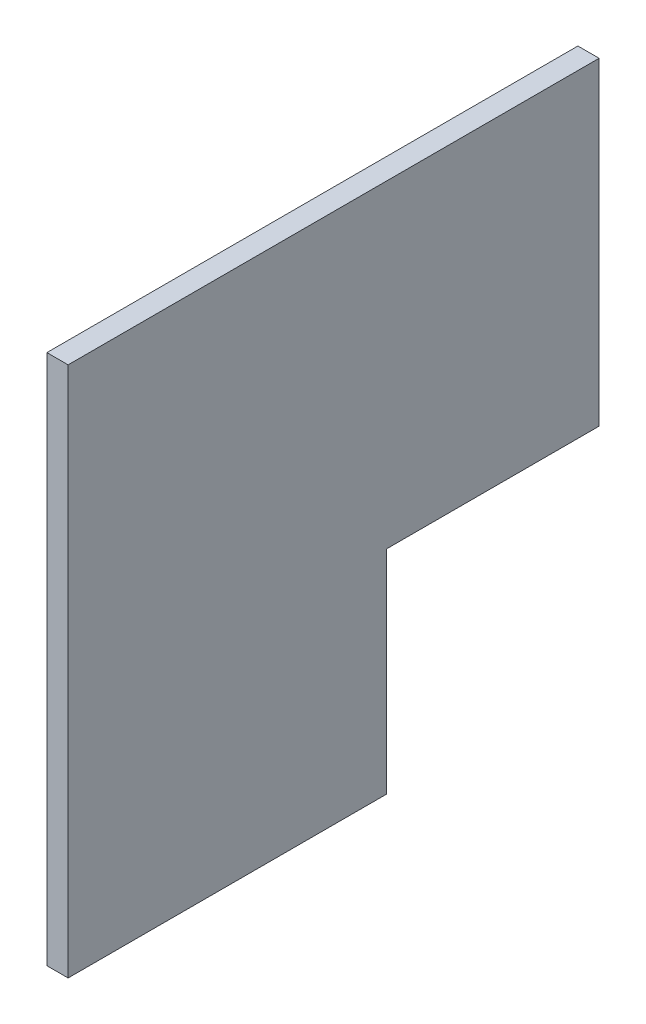
ISO-10303-21;
HEADER;
FILE_DESCRIPTION(('STEP AP214'),'2;1');
FILE_NAME('part.step','',(''),(''),'','','');
FILE_SCHEMA(('AUTOMOTIVE_DESIGN { 1 0 10303 214 1 1 1 1 }'));
ENDSEC;
DATA;
#1=APPLICATION_CONTEXT('core data for automotive mechanical design processes');
#2=APPLICATION_PROTOCOL_DEFINITION('international standard','automotive_design',2000,#1);
#3=PRODUCT_CONTEXT('',#1,'mechanical');
#4=PRODUCT('Part','Part','',(#3));
#5=PRODUCT_RELATED_PRODUCT_CATEGORY('part','',(#4));
#6=PRODUCT_DEFINITION_FORMATION('','',#4);
#7=PRODUCT_DEFINITION_CONTEXT('part definition',#1,'design');
#8=PRODUCT_DEFINITION('design','',#6,#7);
#9=PRODUCT_DEFINITION_SHAPE('','',#8);
#10=(LENGTH_UNIT() NAMED_UNIT(*) SI_UNIT(.MILLI.,.METRE.));
#11=(NAMED_UNIT(*) PLANE_ANGLE_UNIT() SI_UNIT($,.RADIAN.));
#12=(NAMED_UNIT(*) SI_UNIT($,.STERADIAN.) SOLID_ANGLE_UNIT());
#13=UNCERTAINTY_MEASURE_WITH_UNIT(LENGTH_MEASURE(1.E-05),#10,'distance_accuracy_value','');
#14=(GEOMETRIC_REPRESENTATION_CONTEXT(3) GLOBAL_UNCERTAINTY_ASSIGNED_CONTEXT((#13)) GLOBAL_UNIT_ASSIGNED_CONTEXT((#10,
#11,#12)) REPRESENTATION_CONTEXT('',''));
#15=CARTESIAN_POINT('',(0.,0.,0.));
#16=DIRECTION('',(0.,0.,1.));
#17=DIRECTION('',(1.,0.,0.));
#18=AXIS2_PLACEMENT_3D('',#15,#16,#17);
#19=CARTESIAN_POINT('',(10.,100.,100.));
#20=DIRECTION('',(0.,1.,0.));
#21=DIRECTION('',(0.,0.,1.));
#22=AXIS2_PLACEMENT_3D('',#19,#20,#21);
#23=PLANE('',#22);
#24=DIRECTION('',(0.,0.,-1.));
#25=VECTOR('',#24,1.);
#26=CARTESIAN_POINT('',(0.,100.,100.));
#27=LINE('',#26,#25);
#28=CARTESIAN_POINT('',(0.,100.,100.));
#29=VERTEX_POINT('',#28);
#30=CARTESIAN_POINT('',(0.,100.,0.));
#31=VERTEX_POINT('',#30);
#32=EDGE_CURVE('E139',#29,#31,#27,.T.);
#33=ORIENTED_EDGE('',*,*,#32,.T.);
#34=DIRECTION('',(-1.,0.,0.));
#35=VECTOR('',#34,1.);
#36=CARTESIAN_POINT('',(10.,100.,0.));
#37=LINE('',#36,#35);
#38=CARTESIAN_POINT('',(10.,100.,0.));
#39=VERTEX_POINT('',#38);
#40=EDGE_CURVE('E12',#39,#31,#37,.T.);
#41=ORIENTED_EDGE('',*,*,#40,.F.);
#42=DIRECTION('',(0.,0.,-1.));
#43=VECTOR('',#42,1.);
#44=CARTESIAN_POINT('',(10.,100.,100.));
#45=LINE('',#44,#43);
#46=CARTESIAN_POINT('',(10.,100.,100.));
#47=VERTEX_POINT('',#46);
#48=EDGE_CURVE('E152',#47,#39,#45,.T.);
#49=ORIENTED_EDGE('',*,*,#48,.F.);
#50=DIRECTION('',(-1.,0.,0.));
#51=VECTOR('',#50,1.);
#52=CARTESIAN_POINT('',(10.,100.,100.));
#53=LINE('',#52,#51);
#54=EDGE_CURVE('E135',#47,#29,#53,.T.);
#55=ORIENTED_EDGE('',*,*,#54,.T.);
#56=EDGE_LOOP('',(#33,#41,#49,#55));
#57=FACE_BOUND('',#56,.T.);
#58=ADVANCED_FACE('F50',(#57),#23,.F.);
#59=CARTESIAN_POINT('',(10.,100.,0.));
#60=DIRECTION('',(0.,0.,1.));
#61=DIRECTION('',(0.,-1.,0.));
#62=AXIS2_PLACEMENT_3D('',#59,#60,#61);
#63=PLANE('',#62);
#64=DIRECTION('',(0.,1.,0.));
#65=VECTOR('',#64,1.);
#66=CARTESIAN_POINT('',(0.,100.,0.));
#67=LINE('',#66,#65);
#68=CARTESIAN_POINT('',(0.,250.,0.));
#69=VERTEX_POINT('',#68);
#70=EDGE_CURVE('E144',#31,#69,#67,.T.);
#71=ORIENTED_EDGE('',*,*,#70,.T.);
#72=DIRECTION('',(-1.,0.,0.));
#73=VECTOR('',#72,1.);
#74=CARTESIAN_POINT('',(10.,250.,0.));
#75=LINE('',#74,#73);
#76=CARTESIAN_POINT('',(10.,250.,0.));
#77=VERTEX_POINT('',#76);
#78=EDGE_CURVE('E59',#77,#69,#75,.T.);
#79=ORIENTED_EDGE('',*,*,#78,.F.);
#80=DIRECTION('',(0.,1.,0.));
#81=VECTOR('',#80,1.);
#82=CARTESIAN_POINT('',(10.,100.,0.));
#83=LINE('',#82,#81);
#84=EDGE_CURVE('E104',#39,#77,#83,.T.);
#85=ORIENTED_EDGE('',*,*,#84,.F.);
#86=ORIENTED_EDGE('',*,*,#40,.T.);
#87=EDGE_LOOP('',(#71,#79,#85,#86));
#88=FACE_BOUND('',#87,.T.);
#89=ADVANCED_FACE('F167',(#88),#63,.F.);
#90=CARTESIAN_POINT('',(10.,250.,0.));
#91=DIRECTION('',(0.,-1.,0.));
#92=DIRECTION('',(0.,0.,-1.));
#93=AXIS2_PLACEMENT_3D('',#90,#91,#92);
#94=PLANE('',#93);
#95=DIRECTION('',(0.,0.,1.));
#96=VECTOR('',#95,1.);
#97=CARTESIAN_POINT('',(0.,250.,0.));
#98=LINE('',#97,#96);
#99=CARTESIAN_POINT('',(0.,250.,250.));
#100=VERTEX_POINT('',#99);
#101=EDGE_CURVE('E163',#69,#100,#98,.T.);
#102=ORIENTED_EDGE('',*,*,#101,.T.);
#103=DIRECTION('',(-1.,0.,0.));
#104=VECTOR('',#103,1.);
#105=CARTESIAN_POINT('',(10.,250.,250.));
#106=LINE('',#105,#104);
#107=CARTESIAN_POINT('',(10.,250.,250.));
#108=VERTEX_POINT('',#107);
#109=EDGE_CURVE('E128',#108,#100,#106,.T.);
#110=ORIENTED_EDGE('',*,*,#109,.F.);
#111=DIRECTION('',(0.,0.,1.));
#112=VECTOR('',#111,1.);
#113=CARTESIAN_POINT('',(10.,250.,0.));
#114=LINE('',#113,#112);
#115=EDGE_CURVE('E117',#77,#108,#114,.T.);
#116=ORIENTED_EDGE('',*,*,#115,.F.);
#117=ORIENTED_EDGE('',*,*,#78,.T.);
#118=EDGE_LOOP('',(#102,#110,#116,#117));
#119=FACE_BOUND('',#118,.T.);
#120=ADVANCED_FACE('F173',(#119),#94,.F.);
#121=CARTESIAN_POINT('',(10.,250.,250.));
#122=DIRECTION('',(0.,0.,-1.));
#123=DIRECTION('',(0.,1.,0.));
#124=AXIS2_PLACEMENT_3D('',#121,#122,#123);
#125=PLANE('',#124);
#126=DIRECTION('',(0.,-1.,0.));
#127=VECTOR('',#126,1.);
#128=CARTESIAN_POINT('',(0.,250.,250.));
#129=LINE('',#128,#127);
#130=CARTESIAN_POINT('',(0.,0.,250.));
#131=VERTEX_POINT('',#130);
#132=EDGE_CURVE('E126',#100,#131,#129,.T.);
#133=ORIENTED_EDGE('',*,*,#132,.T.);
#134=DIRECTION('',(-1.,0.,0.));
#135=VECTOR('',#134,1.);
#136=CARTESIAN_POINT('',(10.,0.,250.));
#137=LINE('',#136,#135);
#138=CARTESIAN_POINT('',(10.,0.,250.));
#139=VERTEX_POINT('',#138);
#140=EDGE_CURVE('E123',#139,#131,#137,.T.);
#141=ORIENTED_EDGE('',*,*,#140,.F.);
#142=DIRECTION('',(0.,-1.,0.));
#143=VECTOR('',#142,1.);
#144=CARTESIAN_POINT('',(10.,250.,250.));
#145=LINE('',#144,#143);
#146=EDGE_CURVE('E111',#108,#139,#145,.T.);
#147=ORIENTED_EDGE('',*,*,#146,.F.);
#148=ORIENTED_EDGE('',*,*,#109,.T.);
#149=EDGE_LOOP('',(#133,#141,#147,#148));
#150=FACE_BOUND('',#149,.T.);
#151=ADVANCED_FACE('F124',(#150),#125,.F.);
#152=CARTESIAN_POINT('',(10.,0.,250.));
#153=DIRECTION('',(0.,1.,0.));
#154=DIRECTION('',(0.,0.,1.));
#155=AXIS2_PLACEMENT_3D('',#152,#153,#154);
#156=PLANE('',#155);
#157=DIRECTION('',(0.,0.,-1.));
#158=VECTOR('',#157,1.);
#159=CARTESIAN_POINT('',(0.,0.,250.));
#160=LINE('',#159,#158);
#161=CARTESIAN_POINT('',(0.,0.,100.));
#162=VERTEX_POINT('',#161);
#163=EDGE_CURVE('E90',#131,#162,#160,.T.);
#164=ORIENTED_EDGE('',*,*,#163,.T.);
#165=DIRECTION('',(-1.,0.,0.));
#166=VECTOR('',#165,1.);
#167=CARTESIAN_POINT('',(10.,0.,100.));
#168=LINE('',#167,#166);
#169=CARTESIAN_POINT('',(10.,0.,100.));
#170=VERTEX_POINT('',#169);
#171=EDGE_CURVE('E129',#170,#162,#168,.T.);
#172=ORIENTED_EDGE('',*,*,#171,.F.);
#173=DIRECTION('',(0.,0.,-1.));
#174=VECTOR('',#173,1.);
#175=CARTESIAN_POINT('',(10.,0.,250.));
#176=LINE('',#175,#174);
#177=EDGE_CURVE('E115',#139,#170,#176,.T.);
#178=ORIENTED_EDGE('',*,*,#177,.F.);
#179=ORIENTED_EDGE('',*,*,#140,.T.);
#180=EDGE_LOOP('',(#164,#172,#178,#179));
#181=FACE_BOUND('',#180,.T.);
#182=ADVANCED_FACE('F131',(#181),#156,.F.);
#183=CARTESIAN_POINT('',(10.,0.,100.));
#184=DIRECTION('',(0.,0.,1.));
#185=DIRECTION('',(1.,0.,0.));
#186=AXIS2_PLACEMENT_3D('',#183,#184,#185);
#187=PLANE('',#186);
#188=DIRECTION('',(0.,1.,0.));
#189=VECTOR('',#188,1.);
#190=CARTESIAN_POINT('',(0.,0.,100.));
#191=LINE('',#190,#189);
#192=EDGE_CURVE('E96',#162,#29,#191,.T.);
#193=ORIENTED_EDGE('',*,*,#192,.T.);
#194=ORIENTED_EDGE('',*,*,#54,.F.);
#195=DIRECTION('',(0.,1.,0.));
#196=VECTOR('',#195,1.);
#197=CARTESIAN_POINT('',(10.,0.,100.));
#198=LINE('',#197,#196);
#199=EDGE_CURVE('E67',#170,#47,#198,.T.);
#200=ORIENTED_EDGE('',*,*,#199,.F.);
#201=ORIENTED_EDGE('',*,*,#171,.T.);
#202=EDGE_LOOP('',(#193,#194,#200,#201));
#203=FACE_BOUND('',#202,.T.);
#204=ADVANCED_FACE('F185',(#203),#187,.F.);
#205=CARTESIAN_POINT('',(10.,0.,0.));
#206=DIRECTION('',(1.,0.,0.));
#207=DIRECTION('',(0.,0.,-1.));
#208=AXIS2_PLACEMENT_3D('',#205,#206,#207);
#209=PLANE('',#208);
#210=ORIENTED_EDGE('',*,*,#48,.T.);
#211=ORIENTED_EDGE('',*,*,#84,.T.);
#212=ORIENTED_EDGE('',*,*,#115,.T.);
#213=ORIENTED_EDGE('',*,*,#146,.T.);
#214=ORIENTED_EDGE('',*,*,#177,.T.);
#215=ORIENTED_EDGE('',*,*,#199,.T.);
#216=EDGE_LOOP('',(#210,#211,#212,#213,#214,#215));
#217=FACE_BOUND('',#216,.T.);
#218=ADVANCED_FACE('F113',(#217),#209,.T.);
#219=CARTESIAN_POINT('',(0.,0.,0.));
#220=DIRECTION('',(1.,0.,0.));
#221=DIRECTION('',(0.,0.,-1.));
#222=AXIS2_PLACEMENT_3D('',#219,#220,#221);
#223=PLANE('',#222);
#224=ORIENTED_EDGE('',*,*,#32,.F.);
#225=ORIENTED_EDGE('',*,*,#192,.F.);
#226=ORIENTED_EDGE('',*,*,#163,.F.);
#227=ORIENTED_EDGE('',*,*,#132,.F.);
#228=ORIENTED_EDGE('',*,*,#101,.F.);
#229=ORIENTED_EDGE('',*,*,#70,.F.);
#230=EDGE_LOOP('',(#224,#225,#226,#227,#228,#229));
#231=FACE_BOUND('',#230,.T.);
#232=ADVANCED_FACE('F175',(#231),#223,.F.);
#233=CLOSED_SHELL('',(#58,#89,#120,#151,#182,#204,#218,#232));
#234=MANIFOLD_SOLID_BREP('B2',#233);
#235=ADVANCED_BREP_SHAPE_REPRESENTATION('',(#18,#234),#14);
#236=SHAPE_DEFINITION_REPRESENTATION(#9,#235);
ENDSEC;
END-ISO-10303-21;
